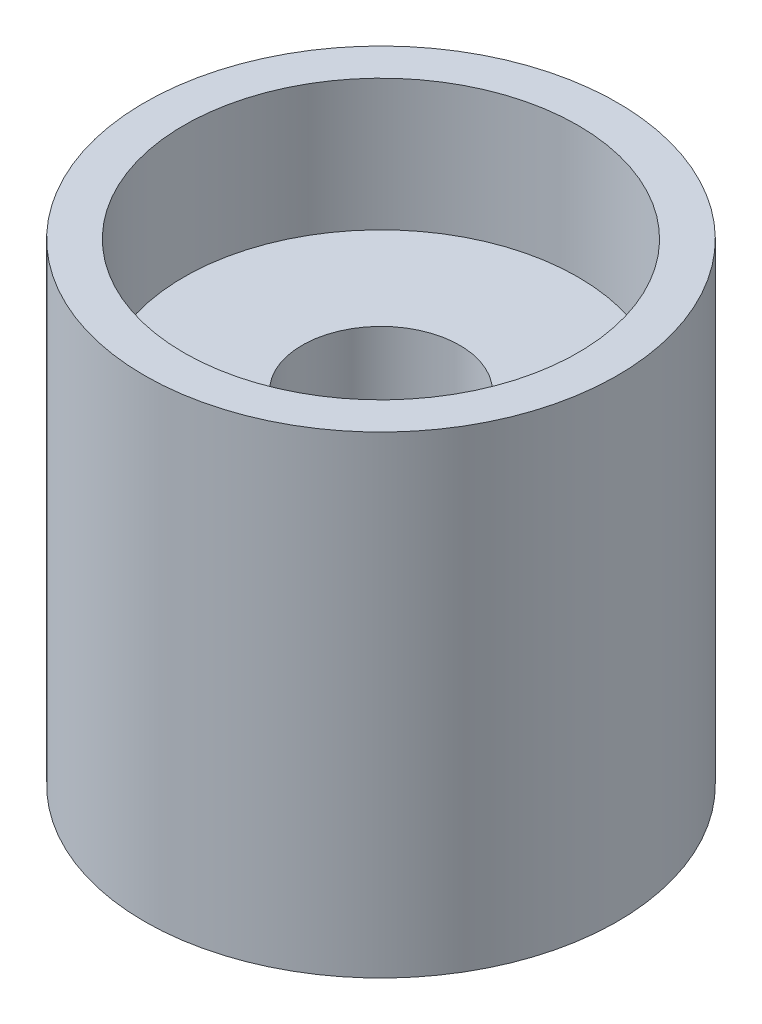
ISO-10303-21;
HEADER;
FILE_DESCRIPTION(('STEP AP214'),'2;1');
FILE_NAME('part.step','',(''),(''),'','','');
FILE_SCHEMA(('AUTOMOTIVE_DESIGN { 1 0 10303 214 1 1 1 1 }'));
ENDSEC;
DATA;
#1=APPLICATION_CONTEXT('core data for automotive mechanical design processes');
#2=APPLICATION_PROTOCOL_DEFINITION('international standard','automotive_design',2000,#1);
#3=PRODUCT_CONTEXT('',#1,'mechanical');
#4=PRODUCT('Part','Part','',(#3));
#5=PRODUCT_RELATED_PRODUCT_CATEGORY('part','',(#4));
#6=PRODUCT_DEFINITION_FORMATION('','',#4);
#7=PRODUCT_DEFINITION_CONTEXT('part definition',#1,'design');
#8=PRODUCT_DEFINITION('design','',#6,#7);
#9=PRODUCT_DEFINITION_SHAPE('','',#8);
#10=(LENGTH_UNIT() NAMED_UNIT(*) SI_UNIT(.MILLI.,.METRE.));
#11=(NAMED_UNIT(*) PLANE_ANGLE_UNIT() SI_UNIT($,.RADIAN.));
#12=(NAMED_UNIT(*) SI_UNIT($,.STERADIAN.) SOLID_ANGLE_UNIT());
#13=UNCERTAINTY_MEASURE_WITH_UNIT(LENGTH_MEASURE(1.E-05),#10,'distance_accuracy_value','');
#14=(GEOMETRIC_REPRESENTATION_CONTEXT(3) GLOBAL_UNCERTAINTY_ASSIGNED_CONTEXT((#13)) GLOBAL_UNIT_ASSIGNED_CONTEXT((#10,
#11,#12)) REPRESENTATION_CONTEXT('',''));
#15=CARTESIAN_POINT('',(0.,0.,0.));
#16=DIRECTION('',(0.,0.,1.));
#17=DIRECTION('',(1.,0.,0.));
#18=AXIS2_PLACEMENT_3D('',#15,#16,#17);
#19=CARTESIAN_POINT('',(0.,18.,0.));
#20=DIRECTION('',(0.,-1.,0.));
#21=DIRECTION('',(0.,0.,-1.));
#22=AXIS2_PLACEMENT_3D('',#19,#20,#21);
#23=CYLINDRICAL_SURFACE('',#22,7.5);
#24=CARTESIAN_POINT('',(0.,0.,0.));
#25=DIRECTION('',(0.,1.,0.));
#26=DIRECTION('',(0.,0.,1.));
#27=AXIS2_PLACEMENT_3D('',#24,#25,#26);
#28=CIRCLE('',#27,7.5);
#29=CARTESIAN_POINT('',(0.,0.,7.5));
#30=VERTEX_POINT('',#29);
#31=EDGE_CURVE('E58',#30,#30,#28,.T.);
#32=ORIENTED_EDGE('',*,*,#31,.F.);
#33=EDGE_LOOP('',(#32));
#34=FACE_BOUND('',#33,.T.);
#35=CARTESIAN_POINT('',(0.,5.,0.));
#36=DIRECTION('',(0.,1.,0.));
#37=DIRECTION('',(0.,0.,1.));
#38=AXIS2_PLACEMENT_3D('',#35,#36,#37);
#39=CIRCLE('',#38,7.5);
#40=CARTESIAN_POINT('',(0.,5.,7.5));
#41=VERTEX_POINT('',#40);
#42=EDGE_CURVE('E62',#41,#41,#39,.T.);
#43=ORIENTED_EDGE('',*,*,#42,.T.);
#44=EDGE_LOOP('',(#43));
#45=FACE_BOUND('',#44,.T.);
#46=ADVANCED_FACE('F37',(#34,#45),#23,.F.);
#47=CARTESIAN_POINT('',(0.,18.,0.));
#48=DIRECTION('',(0.,1.,0.));
#49=DIRECTION('',(0.,0.,1.));
#50=AXIS2_PLACEMENT_3D('',#47,#48,#49);
#51=PLANE('',#50);
#52=CARTESIAN_POINT('',(0.,18.,0.));
#53=DIRECTION('',(0.,1.,0.));
#54=DIRECTION('',(0.,0.,1.));
#55=AXIS2_PLACEMENT_3D('',#52,#53,#54);
#56=CIRCLE('',#55,9.);
#57=CARTESIAN_POINT('',(0.,18.,9.));
#58=VERTEX_POINT('',#57);
#59=EDGE_CURVE('E45',#58,#58,#56,.T.);
#60=ORIENTED_EDGE('',*,*,#59,.T.);
#61=EDGE_LOOP('',(#60));
#62=FACE_BOUND('',#61,.T.);
#63=CARTESIAN_POINT('',(0.,18.,0.));
#64=DIRECTION('',(0.,1.,0.));
#65=DIRECTION('',(0.,0.,1.));
#66=AXIS2_PLACEMENT_3D('',#63,#64,#65);
#67=CIRCLE('',#66,7.5);
#68=CARTESIAN_POINT('',(0.,18.,7.5));
#69=VERTEX_POINT('',#68);
#70=EDGE_CURVE('E56',#69,#69,#67,.T.);
#71=ORIENTED_EDGE('',*,*,#70,.F.);
#72=EDGE_LOOP('',(#71));
#73=FACE_BOUND('',#72,.T.);
#74=ADVANCED_FACE('F96',(#62,#73),#51,.T.);
#75=CARTESIAN_POINT('',(0.,0.,0.));
#76=DIRECTION('',(0.,1.,0.));
#77=DIRECTION('',(0.,0.,1.));
#78=AXIS2_PLACEMENT_3D('',#75,#76,#77);
#79=PLANE('',#78);
#80=CARTESIAN_POINT('',(0.,0.,0.));
#81=DIRECTION('',(0.,1.,0.));
#82=DIRECTION('',(0.,0.,1.));
#83=AXIS2_PLACEMENT_3D('',#80,#81,#82);
#84=CIRCLE('',#83,9.);
#85=CARTESIAN_POINT('',(0.,0.,9.));
#86=VERTEX_POINT('',#85);
#87=EDGE_CURVE('E50',#86,#86,#84,.T.);
#88=ORIENTED_EDGE('',*,*,#87,.F.);
#89=EDGE_LOOP('',(#88));
#90=FACE_BOUND('',#89,.T.);
#91=ORIENTED_EDGE('',*,*,#31,.T.);
#92=EDGE_LOOP('',(#91));
#93=FACE_BOUND('',#92,.T.);
#94=ADVANCED_FACE('F101',(#90,#93),#79,.F.);
#95=CARTESIAN_POINT('',(0.,18.,0.));
#96=DIRECTION('',(0.,-1.,0.));
#97=DIRECTION('',(0.,0.,-1.));
#98=AXIS2_PLACEMENT_3D('',#95,#96,#97);
#99=CYLINDRICAL_SURFACE('',#98,9.);
#100=ORIENTED_EDGE('',*,*,#59,.F.);
#101=EDGE_LOOP('',(#100));
#102=FACE_BOUND('',#101,.T.);
#103=ORIENTED_EDGE('',*,*,#87,.T.);
#104=EDGE_LOOP('',(#103));
#105=FACE_BOUND('',#104,.T.);
#106=ADVANCED_FACE('F39',(#102,#105),#99,.T.);
#107=CARTESIAN_POINT('',(0.,13.,0.));
#108=DIRECTION('',(0.,1.,0.));
#109=DIRECTION('',(0.,0.,1.));
#110=AXIS2_PLACEMENT_3D('',#107,#108,#109);
#111=CIRCLE('',#110,7.5);
#112=CARTESIAN_POINT('',(0.,13.,7.5));
#113=VERTEX_POINT('',#112);
#114=EDGE_CURVE('E10',#113,#113,#111,.T.);
#115=ORIENTED_EDGE('',*,*,#114,.F.);
#116=EDGE_LOOP('',(#115));
#117=FACE_BOUND('',#116,.T.);
#118=ORIENTED_EDGE('',*,*,#70,.T.);
#119=EDGE_LOOP('',(#118));
#120=FACE_BOUND('',#119,.T.);
#121=ADVANCED_FACE('F84',(#117,#120),#23,.F.);
#122=CARTESIAN_POINT('',(0.,13.,0.));
#123=DIRECTION('',(0.,1.,0.));
#124=DIRECTION('',(0.,0.,1.));
#125=AXIS2_PLACEMENT_3D('',#122,#123,#124);
#126=PLANE('',#125);
#127=ORIENTED_EDGE('',*,*,#114,.T.);
#128=EDGE_LOOP('',(#127));
#129=FACE_BOUND('',#128,.T.);
#130=CARTESIAN_POINT('',(0.,13.,0.));
#131=DIRECTION('',(0.,1.,0.));
#132=DIRECTION('',(0.,0.,1.));
#133=AXIS2_PLACEMENT_3D('',#130,#131,#132);
#134=CIRCLE('',#133,3.);
#135=CARTESIAN_POINT('',(0.,13.,3.));
#136=VERTEX_POINT('',#135);
#137=EDGE_CURVE('E69',#136,#136,#134,.T.);
#138=ORIENTED_EDGE('',*,*,#137,.F.);
#139=EDGE_LOOP('',(#138));
#140=FACE_BOUND('',#139,.T.);
#141=ADVANCED_FACE('F81',(#129,#140),#126,.T.);
#142=CARTESIAN_POINT('',(0.,5.,0.));
#143=DIRECTION('',(0.,1.,0.));
#144=DIRECTION('',(0.,0.,1.));
#145=AXIS2_PLACEMENT_3D('',#142,#143,#144);
#146=PLANE('',#145);
#147=ORIENTED_EDGE('',*,*,#42,.F.);
#148=EDGE_LOOP('',(#147));
#149=FACE_BOUND('',#148,.T.);
#150=CARTESIAN_POINT('',(0.,5.,0.));
#151=DIRECTION('',(0.,1.,0.));
#152=DIRECTION('',(0.,0.,1.));
#153=AXIS2_PLACEMENT_3D('',#150,#151,#152);
#154=CIRCLE('',#153,3.);
#155=CARTESIAN_POINT('',(0.,5.,3.));
#156=VERTEX_POINT('',#155);
#157=EDGE_CURVE('E70',#156,#156,#154,.T.);
#158=ORIENTED_EDGE('',*,*,#157,.T.);
#159=EDGE_LOOP('',(#158));
#160=FACE_BOUND('',#159,.T.);
#161=ADVANCED_FACE('F83',(#149,#160),#146,.F.);
#162=CARTESIAN_POINT('',(0.,13.,0.));
#163=DIRECTION('',(0.,-1.,0.));
#164=DIRECTION('',(0.,0.,-1.));
#165=AXIS2_PLACEMENT_3D('',#162,#163,#164);
#166=CYLINDRICAL_SURFACE('',#165,3.);
#167=ORIENTED_EDGE('',*,*,#137,.T.);
#168=EDGE_LOOP('',(#167));
#169=FACE_BOUND('',#168,.T.);
#170=ORIENTED_EDGE('',*,*,#157,.F.);
#171=EDGE_LOOP('',(#170));
#172=FACE_BOUND('',#171,.T.);
#173=ADVANCED_FACE('F78',(#169,#172),#166,.F.);
#174=CLOSED_SHELL('',(#46,#74,#94,#106,#121,#141,#161,#173));
#175=MANIFOLD_SOLID_BREP('B2',#174);
#176=ADVANCED_BREP_SHAPE_REPRESENTATION('',(#18,#175),#14);
#177=SHAPE_DEFINITION_REPRESENTATION(#9,#176);
ENDSEC;
END-ISO-10303-21;
